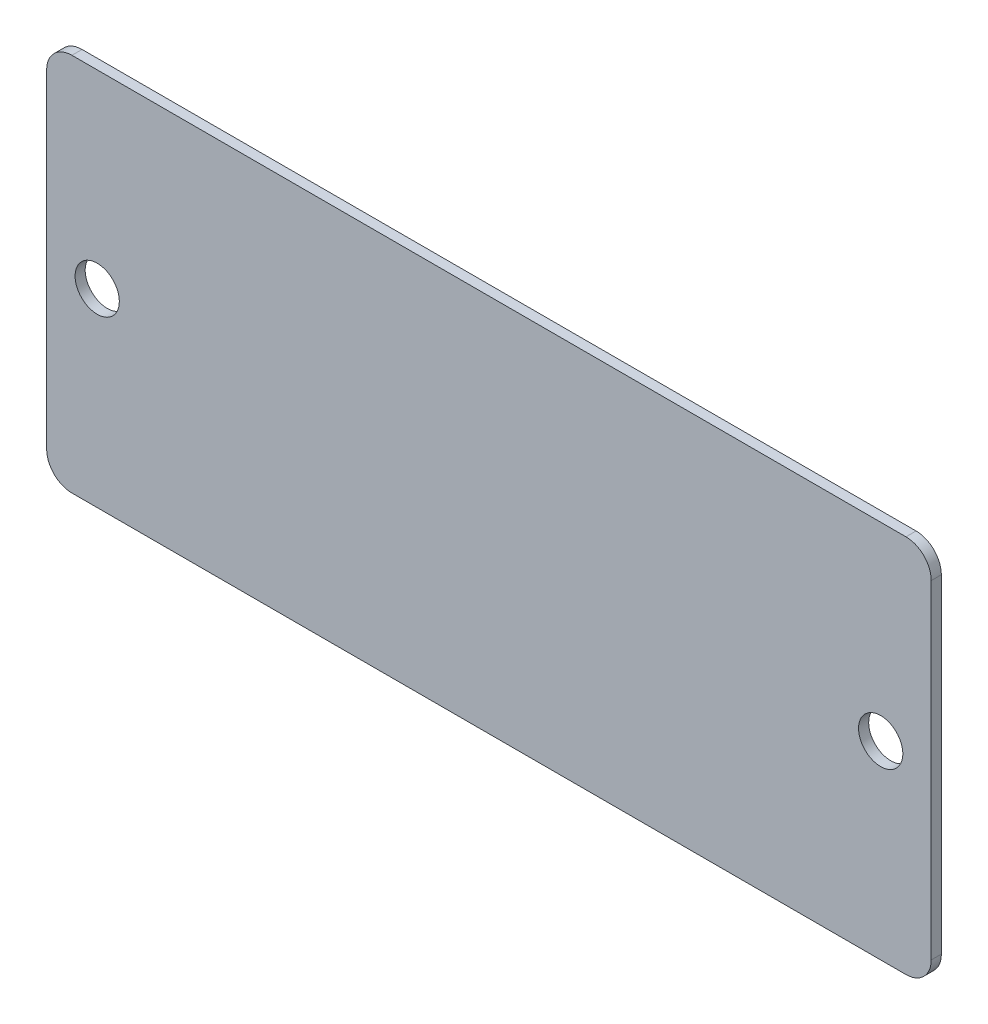
ISO-10303-21;
HEADER;
FILE_DESCRIPTION(('STEP AP214'),'2;1');
FILE_NAME('part.step','',(''),(''),'','','');
FILE_SCHEMA(('AUTOMOTIVE_DESIGN { 1 0 10303 214 1 1 1 1 }'));
ENDSEC;
DATA;
#1=APPLICATION_CONTEXT('core data for automotive mechanical design processes');
#2=APPLICATION_PROTOCOL_DEFINITION('international standard','automotive_design',2000,#1);
#3=PRODUCT_CONTEXT('',#1,'mechanical');
#4=PRODUCT('Part','Part','',(#3));
#5=PRODUCT_RELATED_PRODUCT_CATEGORY('part','',(#4));
#6=PRODUCT_DEFINITION_FORMATION('','',#4);
#7=PRODUCT_DEFINITION_CONTEXT('part definition',#1,'design');
#8=PRODUCT_DEFINITION('design','',#6,#7);
#9=PRODUCT_DEFINITION_SHAPE('','',#8);
#10=(LENGTH_UNIT() NAMED_UNIT(*) SI_UNIT(.MILLI.,.METRE.));
#11=(NAMED_UNIT(*) PLANE_ANGLE_UNIT() SI_UNIT($,.RADIAN.));
#12=(NAMED_UNIT(*) SI_UNIT($,.STERADIAN.) SOLID_ANGLE_UNIT());
#13=UNCERTAINTY_MEASURE_WITH_UNIT(LENGTH_MEASURE(1.E-05),#10,'distance_accuracy_value','');
#14=(GEOMETRIC_REPRESENTATION_CONTEXT(3) GLOBAL_UNCERTAINTY_ASSIGNED_CONTEXT((#13)) GLOBAL_UNIT_ASSIGNED_CONTEXT((#10,
#11,#12)) REPRESENTATION_CONTEXT('',''));
#15=CARTESIAN_POINT('',(0.,0.,0.));
#16=DIRECTION('',(0.,0.,1.));
#17=DIRECTION('',(1.,0.,0.));
#18=AXIS2_PLACEMENT_3D('',#15,#16,#17);
#19=CARTESIAN_POINT('',(35.,-15.,-0.8));
#20=DIRECTION('',(1.,0.,0.));
#21=DIRECTION('',(0.,0.,-1.));
#22=AXIS2_PLACEMENT_3D('',#19,#20,#21);
#23=PLANE('',#22);
#24=DIRECTION('',(0.,1.,0.));
#25=VECTOR('',#24,1.);
#26=CARTESIAN_POINT('',(35.,-15.,-0.8));
#27=LINE('',#26,#25);
#28=CARTESIAN_POINT('',(35.,-13.,-0.8));
#29=VERTEX_POINT('',#28);
#30=CARTESIAN_POINT('',(35.,13.,-0.8));
#31=VERTEX_POINT('',#30);
#32=EDGE_CURVE('E146',#29,#31,#27,.T.);
#33=ORIENTED_EDGE('',*,*,#32,.T.);
#34=DIRECTION('',(0.,0.,1.));
#35=VECTOR('',#34,1.);
#36=CARTESIAN_POINT('',(35.,13.,-0.8));
#37=LINE('',#36,#35);
#38=CARTESIAN_POINT('',(35.,13.,0.));
#39=VERTEX_POINT('',#38);
#40=EDGE_CURVE('E105',#31,#39,#37,.T.);
#41=ORIENTED_EDGE('',*,*,#40,.T.);
#42=DIRECTION('',(0.,1.,0.));
#43=VECTOR('',#42,1.);
#44=CARTESIAN_POINT('',(35.,-15.,0.));
#45=LINE('',#44,#43);
#46=CARTESIAN_POINT('',(35.,-13.,0.));
#47=VERTEX_POINT('',#46);
#48=EDGE_CURVE('E88',#47,#39,#45,.T.);
#49=ORIENTED_EDGE('',*,*,#48,.F.);
#50=DIRECTION('',(0.,0.,1.));
#51=VECTOR('',#50,1.);
#52=CARTESIAN_POINT('',(35.,-13.,-0.8));
#53=LINE('',#52,#51);
#54=EDGE_CURVE('E97',#47,#29,#53,.F.);
#55=ORIENTED_EDGE('',*,*,#54,.T.);
#56=EDGE_LOOP('',(#33,#41,#49,#55));
#57=FACE_BOUND('',#56,.T.);
#58=ADVANCED_FACE('F17',(#57),#23,.T.);
#59=CARTESIAN_POINT('',(-35.,-15.,-0.8));
#60=DIRECTION('',(0.,-1.,0.));
#61=DIRECTION('',(1.,0.,0.));
#62=AXIS2_PLACEMENT_3D('',#59,#60,#61);
#63=PLANE('',#62);
#64=DIRECTION('',(1.,0.,0.));
#65=VECTOR('',#64,1.);
#66=CARTESIAN_POINT('',(-35.,-15.,-0.8));
#67=LINE('',#66,#65);
#68=CARTESIAN_POINT('',(-33.,-15.,-0.8));
#69=VERTEX_POINT('',#68);
#70=CARTESIAN_POINT('',(33.,-15.,-0.8));
#71=VERTEX_POINT('',#70);
#72=EDGE_CURVE('E108',#69,#71,#67,.T.);
#73=ORIENTED_EDGE('',*,*,#72,.T.);
#74=DIRECTION('',(0.,0.,1.));
#75=VECTOR('',#74,1.);
#76=CARTESIAN_POINT('',(33.,-15.,-0.8));
#77=LINE('',#76,#75);
#78=CARTESIAN_POINT('',(33.,-15.,0.));
#79=VERTEX_POINT('',#78);
#80=EDGE_CURVE('E134',#71,#79,#77,.T.);
#81=ORIENTED_EDGE('',*,*,#80,.T.);
#82=DIRECTION('',(1.,0.,0.));
#83=VECTOR('',#82,1.);
#84=CARTESIAN_POINT('',(-35.,-15.,0.));
#85=LINE('',#84,#83);
#86=CARTESIAN_POINT('',(-33.,-15.,0.));
#87=VERTEX_POINT('',#86);
#88=EDGE_CURVE('E86',#87,#79,#85,.T.);
#89=ORIENTED_EDGE('',*,*,#88,.F.);
#90=DIRECTION('',(0.,0.,1.));
#91=VECTOR('',#90,1.);
#92=CARTESIAN_POINT('',(-33.,-15.,-0.8));
#93=LINE('',#92,#91);
#94=EDGE_CURVE('E132',#87,#69,#93,.F.);
#95=ORIENTED_EDGE('',*,*,#94,.T.);
#96=EDGE_LOOP('',(#73,#81,#89,#95));
#97=FACE_BOUND('',#96,.T.);
#98=ADVANCED_FACE('F140',(#97),#63,.T.);
#99=CARTESIAN_POINT('',(-35.,-15.,-0.8));
#100=DIRECTION('',(-1.,0.,0.));
#101=DIRECTION('',(0.,0.,1.));
#102=AXIS2_PLACEMENT_3D('',#99,#100,#101);
#103=PLANE('',#102);
#104=DIRECTION('',(0.,-1.,0.));
#105=VECTOR('',#104,1.);
#106=CARTESIAN_POINT('',(-35.,-15.,-0.8));
#107=LINE('',#106,#105);
#108=CARTESIAN_POINT('',(-35.,13.,-0.8));
#109=VERTEX_POINT('',#108);
#110=CARTESIAN_POINT('',(-35.,-13.,-0.8));
#111=VERTEX_POINT('',#110);
#112=EDGE_CURVE('E111',#109,#111,#107,.T.);
#113=ORIENTED_EDGE('',*,*,#112,.T.);
#114=DIRECTION('',(0.,0.,1.));
#115=VECTOR('',#114,1.);
#116=CARTESIAN_POINT('',(-35.,-13.,-0.8));
#117=LINE('',#116,#115);
#118=CARTESIAN_POINT('',(-35.,-13.,0.));
#119=VERTEX_POINT('',#118);
#120=EDGE_CURVE('E11',#111,#119,#117,.T.);
#121=ORIENTED_EDGE('',*,*,#120,.T.);
#122=DIRECTION('',(0.,-1.,0.));
#123=VECTOR('',#122,1.);
#124=CARTESIAN_POINT('',(-35.,-15.,0.));
#125=LINE('',#124,#123);
#126=CARTESIAN_POINT('',(-35.,13.,0.));
#127=VERTEX_POINT('',#126);
#128=EDGE_CURVE('E148',#127,#119,#125,.T.);
#129=ORIENTED_EDGE('',*,*,#128,.F.);
#130=DIRECTION('',(0.,0.,1.));
#131=VECTOR('',#130,1.);
#132=CARTESIAN_POINT('',(-35.,13.,-0.8));
#133=LINE('',#132,#131);
#134=EDGE_CURVE('E25',#127,#109,#133,.F.);
#135=ORIENTED_EDGE('',*,*,#134,.T.);
#136=EDGE_LOOP('',(#113,#121,#129,#135));
#137=FACE_BOUND('',#136,.T.);
#138=ADVANCED_FACE('F144',(#137),#103,.T.);
#139=CARTESIAN_POINT('',(-35.,15.,-0.8));
#140=DIRECTION('',(0.,1.,0.));
#141=DIRECTION('',(0.,0.,1.));
#142=AXIS2_PLACEMENT_3D('',#139,#140,#141);
#143=PLANE('',#142);
#144=DIRECTION('',(-1.,0.,0.));
#145=VECTOR('',#144,1.);
#146=CARTESIAN_POINT('',(-35.,15.,0.));
#147=LINE('',#146,#145);
#148=CARTESIAN_POINT('',(33.,15.,0.));
#149=VERTEX_POINT('',#148);
#150=CARTESIAN_POINT('',(-33.,15.,0.));
#151=VERTEX_POINT('',#150);
#152=EDGE_CURVE('E103',#149,#151,#147,.T.);
#153=ORIENTED_EDGE('',*,*,#152,.F.);
#154=DIRECTION('',(0.,0.,1.));
#155=VECTOR('',#154,1.);
#156=CARTESIAN_POINT('',(33.,15.,-0.8));
#157=LINE('',#156,#155);
#158=CARTESIAN_POINT('',(33.,15.,-0.8));
#159=VERTEX_POINT('',#158);
#160=EDGE_CURVE('E123',#149,#159,#157,.F.);
#161=ORIENTED_EDGE('',*,*,#160,.T.);
#162=DIRECTION('',(-1.,0.,0.));
#163=VECTOR('',#162,1.);
#164=CARTESIAN_POINT('',(-35.,15.,-0.8));
#165=LINE('',#164,#163);
#166=CARTESIAN_POINT('',(-33.,15.,-0.8));
#167=VERTEX_POINT('',#166);
#168=EDGE_CURVE('E155',#159,#167,#165,.T.);
#169=ORIENTED_EDGE('',*,*,#168,.T.);
#170=DIRECTION('',(0.,0.,1.));
#171=VECTOR('',#170,1.);
#172=CARTESIAN_POINT('',(-33.,15.,-0.8));
#173=LINE('',#172,#171);
#174=EDGE_CURVE('E125',#167,#151,#173,.T.);
#175=ORIENTED_EDGE('',*,*,#174,.T.);
#176=EDGE_LOOP('',(#153,#161,#169,#175));
#177=FACE_BOUND('',#176,.T.);
#178=ADVANCED_FACE('F203',(#177),#143,.T.);
#179=CARTESIAN_POINT('',(0.,0.,-0.8));
#180=DIRECTION('',(0.,0.,-1.));
#181=DIRECTION('',(-1.,0.,0.));
#182=AXIS2_PLACEMENT_3D('',#179,#180,#181);
#183=PLANE('',#182);
#184=CARTESIAN_POINT('',(31.,0.,-0.8));
#185=DIRECTION('',(0.,0.,1.));
#186=DIRECTION('',(-1.,0.,0.));
#187=AXIS2_PLACEMENT_3D('',#184,#185,#186);
#188=CIRCLE('',#187,1.75);
#189=CARTESIAN_POINT('',(29.25,0.,-0.8));
#190=VERTEX_POINT('',#189);
#191=EDGE_CURVE('E157',#190,#190,#188,.T.);
#192=ORIENTED_EDGE('',*,*,#191,.T.);
#193=EDGE_LOOP('',(#192));
#194=FACE_BOUND('',#193,.T.);
#195=CARTESIAN_POINT('',(-31.,0.,-0.8));
#196=DIRECTION('',(0.,0.,1.));
#197=DIRECTION('',(1.,0.,0.));
#198=AXIS2_PLACEMENT_3D('',#195,#196,#197);
#199=CIRCLE('',#198,1.75);
#200=CARTESIAN_POINT('',(-29.25,0.,-0.8));
#201=VERTEX_POINT('',#200);
#202=EDGE_CURVE('E102',#201,#201,#199,.T.);
#203=ORIENTED_EDGE('',*,*,#202,.T.);
#204=EDGE_LOOP('',(#203));
#205=FACE_BOUND('',#204,.T.);
#206=ORIENTED_EDGE('',*,*,#168,.F.);
#207=CARTESIAN_POINT('',(33.,13.,-0.8));
#208=DIRECTION('',(0.,0.,-1.));
#209=DIRECTION('',(-1.,0.,0.));
#210=AXIS2_PLACEMENT_3D('',#207,#208,#209);
#211=CIRCLE('',#210,2.);
#212=EDGE_CURVE('E131',#159,#31,#211,.T.);
#213=ORIENTED_EDGE('',*,*,#212,.T.);
#214=ORIENTED_EDGE('',*,*,#32,.F.);
#215=CARTESIAN_POINT('',(33.,-13.,-0.8));
#216=DIRECTION('',(0.,0.,-1.));
#217=DIRECTION('',(-1.,0.,0.));
#218=AXIS2_PLACEMENT_3D('',#215,#216,#217);
#219=CIRCLE('',#218,2.);
#220=EDGE_CURVE('E107',#29,#71,#219,.T.);
#221=ORIENTED_EDGE('',*,*,#220,.T.);
#222=ORIENTED_EDGE('',*,*,#72,.F.);
#223=CARTESIAN_POINT('',(-33.,-13.,-0.8));
#224=DIRECTION('',(0.,0.,-1.));
#225=DIRECTION('',(-1.,0.,0.));
#226=AXIS2_PLACEMENT_3D('',#223,#224,#225);
#227=CIRCLE('',#226,2.);
#228=EDGE_CURVE('E32',#69,#111,#227,.T.);
#229=ORIENTED_EDGE('',*,*,#228,.T.);
#230=ORIENTED_EDGE('',*,*,#112,.F.);
#231=CARTESIAN_POINT('',(-33.,13.,-0.8));
#232=DIRECTION('',(0.,0.,-1.));
#233=DIRECTION('',(-1.,0.,0.));
#234=AXIS2_PLACEMENT_3D('',#231,#232,#233);
#235=CIRCLE('',#234,2.);
#236=EDGE_CURVE('E126',#109,#167,#235,.T.);
#237=ORIENTED_EDGE('',*,*,#236,.T.);
#238=EDGE_LOOP('',(#206,#213,#214,#221,#222,#229,#230,#237));
#239=FACE_BOUND('',#238,.T.);
#240=ADVANCED_FACE('F139',(#194,#205,#239),#183,.T.);
#241=CARTESIAN_POINT('',(0.,0.,0.));
#242=DIRECTION('',(0.,0.,-1.));
#243=DIRECTION('',(-1.,0.,0.));
#244=AXIS2_PLACEMENT_3D('',#241,#242,#243);
#245=PLANE('',#244);
#246=CARTESIAN_POINT('',(31.,0.,0.));
#247=DIRECTION('',(0.,0.,1.));
#248=DIRECTION('',(-1.,0.,0.));
#249=AXIS2_PLACEMENT_3D('',#246,#247,#248);
#250=CIRCLE('',#249,1.75);
#251=CARTESIAN_POINT('',(29.25,0.,0.));
#252=VERTEX_POINT('',#251);
#253=EDGE_CURVE('E165',#252,#252,#250,.T.);
#254=ORIENTED_EDGE('',*,*,#253,.F.);
#255=EDGE_LOOP('',(#254));
#256=FACE_BOUND('',#255,.T.);
#257=CARTESIAN_POINT('',(-31.,0.,0.));
#258=DIRECTION('',(0.,0.,1.));
#259=DIRECTION('',(1.,0.,0.));
#260=AXIS2_PLACEMENT_3D('',#257,#258,#259);
#261=CIRCLE('',#260,1.75);
#262=CARTESIAN_POINT('',(-29.25,0.,0.));
#263=VERTEX_POINT('',#262);
#264=EDGE_CURVE('E156',#263,#263,#261,.T.);
#265=ORIENTED_EDGE('',*,*,#264,.F.);
#266=EDGE_LOOP('',(#265));
#267=FACE_BOUND('',#266,.T.);
#268=ORIENTED_EDGE('',*,*,#48,.T.);
#269=CARTESIAN_POINT('',(33.,13.,0.));
#270=DIRECTION('',(0.,0.,-1.));
#271=DIRECTION('',(-1.,0.,0.));
#272=AXIS2_PLACEMENT_3D('',#269,#270,#271);
#273=CIRCLE('',#272,2.);
#274=EDGE_CURVE('E91',#39,#149,#273,.F.);
#275=ORIENTED_EDGE('',*,*,#274,.T.);
#276=ORIENTED_EDGE('',*,*,#152,.T.);
#277=CARTESIAN_POINT('',(-33.,13.,0.));
#278=DIRECTION('',(0.,0.,-1.));
#279=DIRECTION('',(-1.,0.,0.));
#280=AXIS2_PLACEMENT_3D('',#277,#278,#279);
#281=CIRCLE('',#280,2.);
#282=EDGE_CURVE('E112',#151,#127,#281,.F.);
#283=ORIENTED_EDGE('',*,*,#282,.T.);
#284=ORIENTED_EDGE('',*,*,#128,.T.);
#285=CARTESIAN_POINT('',(-33.,-13.,0.));
#286=DIRECTION('',(0.,0.,-1.));
#287=DIRECTION('',(-1.,0.,0.));
#288=AXIS2_PLACEMENT_3D('',#285,#286,#287);
#289=CIRCLE('',#288,2.);
#290=EDGE_CURVE('E94',#119,#87,#289,.F.);
#291=ORIENTED_EDGE('',*,*,#290,.T.);
#292=ORIENTED_EDGE('',*,*,#88,.T.);
#293=CARTESIAN_POINT('',(33.,-13.,0.));
#294=DIRECTION('',(0.,0.,-1.));
#295=DIRECTION('',(-1.,0.,0.));
#296=AXIS2_PLACEMENT_3D('',#293,#294,#295);
#297=CIRCLE('',#296,2.);
#298=EDGE_CURVE('E83',#79,#47,#297,.F.);
#299=ORIENTED_EDGE('',*,*,#298,.T.);
#300=EDGE_LOOP('',(#268,#275,#276,#283,#284,#291,#292,#299));
#301=FACE_BOUND('',#300,.T.);
#302=ADVANCED_FACE('F84',(#256,#267,#301),#245,.F.);
#303=CARTESIAN_POINT('',(-31.,0.,-0.8));
#304=DIRECTION('',(0.,0.,1.));
#305=DIRECTION('',(1.,0.,0.));
#306=AXIS2_PLACEMENT_3D('',#303,#304,#305);
#307=CYLINDRICAL_SURFACE('',#306,1.75);
#308=ORIENTED_EDGE('',*,*,#202,.F.);
#309=EDGE_LOOP('',(#308));
#310=FACE_BOUND('',#309,.T.);
#311=ORIENTED_EDGE('',*,*,#264,.T.);
#312=EDGE_LOOP('',(#311));
#313=FACE_BOUND('',#312,.T.);
#314=ADVANCED_FACE('F173',(#310,#313),#307,.F.);
#315=CARTESIAN_POINT('',(31.,0.,-0.8));
#316=DIRECTION('',(0.,0.,1.));
#317=DIRECTION('',(1.,0.,0.));
#318=AXIS2_PLACEMENT_3D('',#315,#316,#317);
#319=CYLINDRICAL_SURFACE('',#318,1.75);
#320=ORIENTED_EDGE('',*,*,#191,.F.);
#321=EDGE_LOOP('',(#320));
#322=FACE_BOUND('',#321,.T.);
#323=ORIENTED_EDGE('',*,*,#253,.T.);
#324=EDGE_LOOP('',(#323));
#325=FACE_BOUND('',#324,.T.);
#326=ADVANCED_FACE('F168',(#322,#325),#319,.F.);
#327=CARTESIAN_POINT('',(33.,13.,-0.8));
#328=DIRECTION('',(0.,0.,1.));
#329=DIRECTION('',(1.,0.,0.));
#330=AXIS2_PLACEMENT_3D('',#327,#328,#329);
#331=CYLINDRICAL_SURFACE('',#330,2.);
#332=ORIENTED_EDGE('',*,*,#212,.F.);
#333=ORIENTED_EDGE('',*,*,#160,.F.);
#334=ORIENTED_EDGE('',*,*,#274,.F.);
#335=ORIENTED_EDGE('',*,*,#40,.F.);
#336=EDGE_LOOP('',(#332,#333,#334,#335));
#337=FACE_BOUND('',#336,.T.);
#338=ADVANCED_FACE('F174',(#337),#331,.T.);
#339=CARTESIAN_POINT('',(33.,-13.,-0.8));
#340=DIRECTION('',(0.,0.,1.));
#341=DIRECTION('',(1.,0.,0.));
#342=AXIS2_PLACEMENT_3D('',#339,#340,#341);
#343=CYLINDRICAL_SURFACE('',#342,2.);
#344=ORIENTED_EDGE('',*,*,#220,.F.);
#345=ORIENTED_EDGE('',*,*,#54,.F.);
#346=ORIENTED_EDGE('',*,*,#298,.F.);
#347=ORIENTED_EDGE('',*,*,#80,.F.);
#348=EDGE_LOOP('',(#344,#345,#346,#347));
#349=FACE_BOUND('',#348,.T.);
#350=ADVANCED_FACE('F110',(#349),#343,.T.);
#351=CARTESIAN_POINT('',(-33.,-13.,-0.8));
#352=DIRECTION('',(0.,0.,1.));
#353=DIRECTION('',(1.,0.,0.));
#354=AXIS2_PLACEMENT_3D('',#351,#352,#353);
#355=CYLINDRICAL_SURFACE('',#354,2.);
#356=ORIENTED_EDGE('',*,*,#228,.F.);
#357=ORIENTED_EDGE('',*,*,#94,.F.);
#358=ORIENTED_EDGE('',*,*,#290,.F.);
#359=ORIENTED_EDGE('',*,*,#120,.F.);
#360=EDGE_LOOP('',(#356,#357,#358,#359));
#361=FACE_BOUND('',#360,.T.);
#362=ADVANCED_FACE('F141',(#361),#355,.T.);
#363=CARTESIAN_POINT('',(-33.,13.,-0.8));
#364=DIRECTION('',(0.,0.,1.));
#365=DIRECTION('',(1.,0.,0.));
#366=AXIS2_PLACEMENT_3D('',#363,#364,#365);
#367=CYLINDRICAL_SURFACE('',#366,2.);
#368=ORIENTED_EDGE('',*,*,#236,.F.);
#369=ORIENTED_EDGE('',*,*,#134,.F.);
#370=ORIENTED_EDGE('',*,*,#282,.F.);
#371=ORIENTED_EDGE('',*,*,#174,.F.);
#372=EDGE_LOOP('',(#368,#369,#370,#371));
#373=FACE_BOUND('',#372,.T.);
#374=ADVANCED_FACE('F19',(#373),#367,.T.);
#375=CLOSED_SHELL('',(#58,#98,#138,#178,#240,#302,#314,#326,#338,#350,#362,#374));
#376=MANIFOLD_SOLID_BREP('B1',#375);
#377=ADVANCED_BREP_SHAPE_REPRESENTATION('',(#18,#376),#14);
#378=SHAPE_DEFINITION_REPRESENTATION(#9,#377);
ENDSEC;
END-ISO-10303-21;
